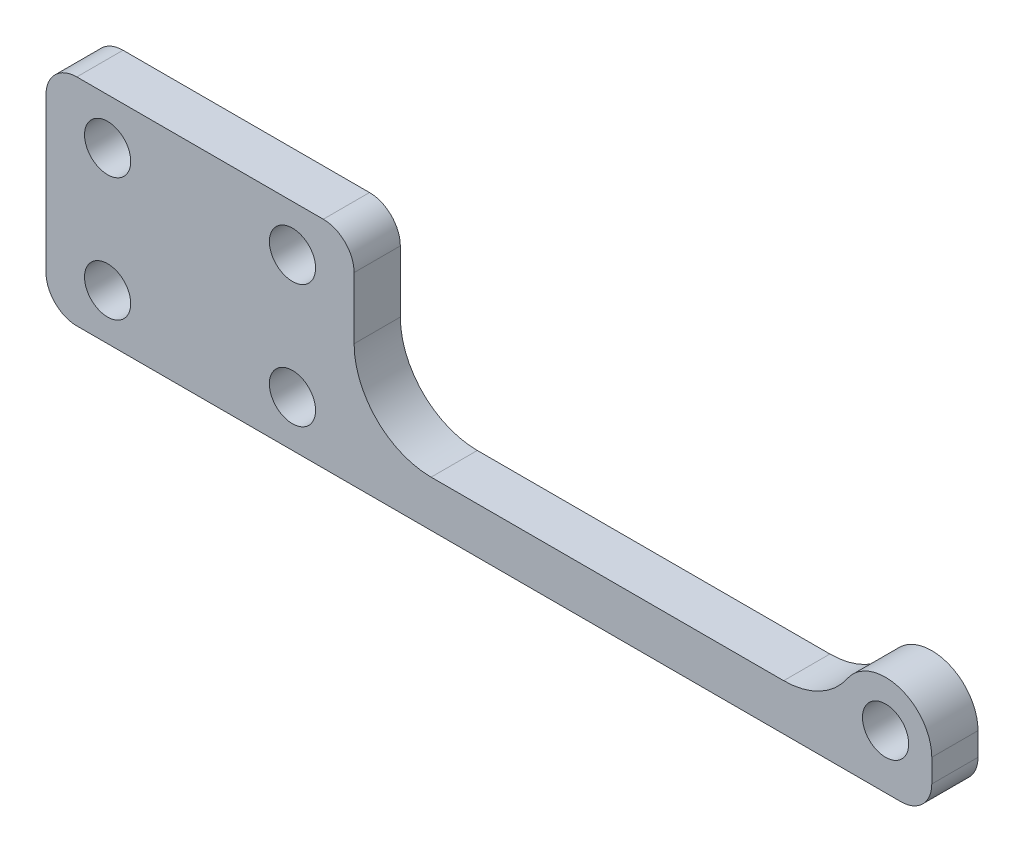
ISO-10303-21;
HEADER;
FILE_DESCRIPTION(('STEP AP214'),'2;1');
FILE_NAME('part.step','',(''),(''),'','','');
FILE_SCHEMA(('AUTOMOTIVE_DESIGN { 1 0 10303 214 1 1 1 1 }'));
ENDSEC;
DATA;
#1=APPLICATION_CONTEXT('core data for automotive mechanical design processes');
#2=APPLICATION_PROTOCOL_DEFINITION('international standard','automotive_design',2000,#1);
#3=PRODUCT_CONTEXT('',#1,'mechanical');
#4=PRODUCT('Part','Part','',(#3));
#5=PRODUCT_RELATED_PRODUCT_CATEGORY('part','',(#4));
#6=PRODUCT_DEFINITION_FORMATION('','',#4);
#7=PRODUCT_DEFINITION_CONTEXT('part definition',#1,'design');
#8=PRODUCT_DEFINITION('design','',#6,#7);
#9=PRODUCT_DEFINITION_SHAPE('','',#8);
#10=(LENGTH_UNIT() NAMED_UNIT(*) SI_UNIT(.MILLI.,.METRE.));
#11=(NAMED_UNIT(*) PLANE_ANGLE_UNIT() SI_UNIT($,.RADIAN.));
#12=(NAMED_UNIT(*) SI_UNIT($,.STERADIAN.) SOLID_ANGLE_UNIT());
#13=UNCERTAINTY_MEASURE_WITH_UNIT(LENGTH_MEASURE(1.E-05),#10,'distance_accuracy_value','');
#14=(GEOMETRIC_REPRESENTATION_CONTEXT(3) GLOBAL_UNCERTAINTY_ASSIGNED_CONTEXT((#13)) GLOBAL_UNIT_ASSIGNED_CONTEXT((#10,
#11,#12)) REPRESENTATION_CONTEXT('',''));
#15=CARTESIAN_POINT('',(0.,0.,0.));
#16=DIRECTION('',(0.,0.,1.));
#17=DIRECTION('',(1.,0.,0.));
#18=AXIS2_PLACEMENT_3D('',#15,#16,#17);
#19=CARTESIAN_POINT('',(-10.,0.,3.));
#20=DIRECTION('',(-1.,0.,0.));
#21=DIRECTION('',(0.,-1.,0.));
#22=AXIS2_PLACEMENT_3D('',#19,#20,#21);
#23=PLANE('',#22);
#24=DIRECTION('',(0.,1.,0.));
#25=VECTOR('',#24,1.);
#26=CARTESIAN_POINT('',(-10.,0.,0.));
#27=LINE('',#26,#25);
#28=CARTESIAN_POINT('',(-10.,-5.,0.));
#29=VERTEX_POINT('',#28);
#30=CARTESIAN_POINT('',(-10.,5.,0.));
#31=VERTEX_POINT('',#30);
#32=EDGE_CURVE('E258',#29,#31,#27,.T.);
#33=ORIENTED_EDGE('',*,*,#32,.F.);
#34=DIRECTION('',(0.,0.,-1.));
#35=VECTOR('',#34,1.);
#36=CARTESIAN_POINT('',(-10.,-5.,3.));
#37=LINE('',#36,#35);
#38=CARTESIAN_POINT('',(-10.,-5.,3.));
#39=VERTEX_POINT('',#38);
#40=EDGE_CURVE('E191',#29,#39,#37,.F.);
#41=ORIENTED_EDGE('',*,*,#40,.T.);
#42=DIRECTION('',(0.,1.,0.));
#43=VECTOR('',#42,1.);
#44=CARTESIAN_POINT('',(-10.,0.,3.));
#45=LINE('',#44,#43);
#46=CARTESIAN_POINT('',(-10.,5.,3.));
#47=VERTEX_POINT('',#46);
#48=EDGE_CURVE('E287',#39,#47,#45,.T.);
#49=ORIENTED_EDGE('',*,*,#48,.T.);
#50=DIRECTION('',(0.,0.,-1.));
#51=VECTOR('',#50,1.);
#52=CARTESIAN_POINT('',(-10.,5.,0.));
#53=LINE('',#52,#51);
#54=EDGE_CURVE('E188',#47,#31,#53,.T.);
#55=ORIENTED_EDGE('',*,*,#54,.T.);
#56=EDGE_LOOP('',(#33,#41,#49,#55));
#57=FACE_BOUND('',#56,.T.);
#58=ADVANCED_FACE('F43',(#57),#23,.T.);
#59=CARTESIAN_POINT('',(0.,-7.,3.));
#60=DIRECTION('',(0.,-1.,0.));
#61=DIRECTION('',(1.,0.,0.));
#62=AXIS2_PLACEMENT_3D('',#59,#60,#61);
#63=PLANE('',#62);
#64=DIRECTION('',(-1.,0.,0.));
#65=VECTOR('',#64,1.);
#66=CARTESIAN_POINT('',(0.,-7.,3.));
#67=LINE('',#66,#65);
#68=CARTESIAN_POINT('',(45.5,-6.99999999999999,3.));
#69=VERTEX_POINT('',#68);
#70=CARTESIAN_POINT('',(-8.,-7.,3.));
#71=VERTEX_POINT('',#70);
#72=EDGE_CURVE('E150',#69,#71,#67,.T.);
#73=ORIENTED_EDGE('',*,*,#72,.T.);
#74=DIRECTION('',(0.,0.,-1.));
#75=VECTOR('',#74,1.);
#76=CARTESIAN_POINT('',(-8.,-7.,3.));
#77=LINE('',#76,#75);
#78=CARTESIAN_POINT('',(-8.,-7.,0.));
#79=VERTEX_POINT('',#78);
#80=EDGE_CURVE('E168',#71,#79,#77,.T.);
#81=ORIENTED_EDGE('',*,*,#80,.T.);
#82=DIRECTION('',(-1.,0.,0.));
#83=VECTOR('',#82,1.);
#84=CARTESIAN_POINT('',(0.,-7.,0.));
#85=LINE('',#84,#83);
#86=CARTESIAN_POINT('',(45.5,-6.99999999999999,0.));
#87=VERTEX_POINT('',#86);
#88=EDGE_CURVE('E261',#87,#79,#85,.T.);
#89=ORIENTED_EDGE('',*,*,#88,.F.);
#90=DIRECTION('',(0.,0.,-1.));
#91=VECTOR('',#90,1.);
#92=CARTESIAN_POINT('',(45.5,-6.99999999999999,3.));
#93=LINE('',#92,#91);
#94=EDGE_CURVE('E165',#87,#69,#93,.F.);
#95=ORIENTED_EDGE('',*,*,#94,.T.);
#96=EDGE_LOOP('',(#73,#81,#89,#95));
#97=FACE_BOUND('',#96,.T.);
#98=ADVANCED_FACE('F293',(#97),#63,.T.);
#99=CARTESIAN_POINT('',(47.5,0.,3.));
#100=DIRECTION('',(-1.,0.,0.));
#101=DIRECTION('',(0.,0.,1.));
#102=AXIS2_PLACEMENT_3D('',#99,#100,#101);
#103=PLANE('',#102);
#104=DIRECTION('',(0.,1.,0.));
#105=VECTOR('',#104,1.);
#106=CARTESIAN_POINT('',(47.5,0.,3.));
#107=LINE('',#106,#105);
#108=CARTESIAN_POINT('',(47.5,-4.99999999999999,3.));
#109=VERTEX_POINT('',#108);
#110=CARTESIAN_POINT('',(47.5,-3.5,3.));
#111=VERTEX_POINT('',#110);
#112=EDGE_CURVE('E136',#109,#111,#107,.T.);
#113=ORIENTED_EDGE('',*,*,#112,.F.);
#114=DIRECTION('',(0.,0.,-1.));
#115=VECTOR('',#114,1.);
#116=CARTESIAN_POINT('',(47.5,-4.99999999999999,0.));
#117=LINE('',#116,#115);
#118=CARTESIAN_POINT('',(47.5,-4.99999999999999,0.));
#119=VERTEX_POINT('',#118);
#120=EDGE_CURVE('E208',#109,#119,#117,.T.);
#121=ORIENTED_EDGE('',*,*,#120,.T.);
#122=DIRECTION('',(0.,1.,0.));
#123=VECTOR('',#122,1.);
#124=CARTESIAN_POINT('',(47.5,0.,0.));
#125=LINE('',#124,#123);
#126=CARTESIAN_POINT('',(47.5,-3.5,0.));
#127=VERTEX_POINT('',#126);
#128=EDGE_CURVE('E163',#119,#127,#125,.T.);
#129=ORIENTED_EDGE('',*,*,#128,.T.);
#130=DIRECTION('',(0.,0.,-1.));
#131=VECTOR('',#130,1.);
#132=CARTESIAN_POINT('',(47.5,-3.5,3.));
#133=LINE('',#132,#131);
#134=EDGE_CURVE('E156',#111,#127,#133,.T.);
#135=ORIENTED_EDGE('',*,*,#134,.F.);
#136=EDGE_LOOP('',(#113,#121,#129,#135));
#137=FACE_BOUND('',#136,.T.);
#138=ADVANCED_FACE('F161',(#137),#103,.F.);
#139=CARTESIAN_POINT('',(44.5,-3.5,3.));
#140=DIRECTION('',(0.,0.,-1.));
#141=DIRECTION('',(-1.,0.,0.));
#142=AXIS2_PLACEMENT_3D('',#139,#140,#141);
#143=CYLINDRICAL_SURFACE('',#142,3.);
#144=CARTESIAN_POINT('',(44.5,-3.5,0.));
#145=DIRECTION('',(0.,0.,1.));
#146=DIRECTION('',(1.,0.,0.));
#147=AXIS2_PLACEMENT_3D('',#144,#145,#146);
#148=CIRCLE('',#147,3.);
#149=CARTESIAN_POINT('',(42.0196081458769,-1.8125,0.));
#150=VERTEX_POINT('',#149);
#151=EDGE_CURVE('E234',#127,#150,#148,.T.);
#152=ORIENTED_EDGE('',*,*,#151,.T.);
#153=DIRECTION('',(0.,0.,-1.));
#154=VECTOR('',#153,1.);
#155=CARTESIAN_POINT('',(42.0196081458769,-1.8125,3.));
#156=LINE('',#155,#154);
#157=CARTESIAN_POINT('',(42.0196081458769,-1.8125,3.));
#158=VERTEX_POINT('',#157);
#159=EDGE_CURVE('E158',#150,#158,#156,.F.);
#160=ORIENTED_EDGE('',*,*,#159,.T.);
#161=CARTESIAN_POINT('',(44.5,-3.5,3.));
#162=DIRECTION('',(0.,0.,1.));
#163=DIRECTION('',(1.,0.,0.));
#164=AXIS2_PLACEMENT_3D('',#161,#162,#163);
#165=CIRCLE('',#164,3.);
#166=EDGE_CURVE('E141',#111,#158,#165,.T.);
#167=ORIENTED_EDGE('',*,*,#166,.F.);
#168=ORIENTED_EDGE('',*,*,#134,.T.);
#169=EDGE_LOOP('',(#152,#160,#167,#168));
#170=FACE_BOUND('',#169,.T.);
#171=ADVANCED_FACE('F155',(#170),#143,.T.);
#172=CARTESIAN_POINT('',(0.,-4.,3.));
#173=DIRECTION('',(0.,1.,0.));
#174=DIRECTION('',(0.,0.,1.));
#175=AXIS2_PLACEMENT_3D('',#172,#173,#174);
#176=PLANE('',#175);
#177=DIRECTION('',(1.,0.,0.));
#178=VECTOR('',#177,1.);
#179=CARTESIAN_POINT('',(0.,-4.,3.));
#180=LINE('',#179,#178);
#181=CARTESIAN_POINT('',(15.,-4.,3.));
#182=VERTEX_POINT('',#181);
#183=CARTESIAN_POINT('',(37.8856217223385,-4.,3.));
#184=VERTEX_POINT('',#183);
#185=EDGE_CURVE('E159',#182,#184,#180,.T.);
#186=ORIENTED_EDGE('',*,*,#185,.T.);
#187=DIRECTION('',(0.,0.,-1.));
#188=VECTOR('',#187,1.);
#189=CARTESIAN_POINT('',(37.8856217223385,-4.,3.));
#190=LINE('',#189,#188);
#191=CARTESIAN_POINT('',(37.8856217223385,-4.,0.));
#192=VERTEX_POINT('',#191);
#193=EDGE_CURVE('E212',#184,#192,#190,.T.);
#194=ORIENTED_EDGE('',*,*,#193,.T.);
#195=DIRECTION('',(1.,0.,0.));
#196=VECTOR('',#195,1.);
#197=CARTESIAN_POINT('',(0.,-4.,0.));
#198=LINE('',#197,#196);
#199=CARTESIAN_POINT('',(15.,-4.,0.));
#200=VERTEX_POINT('',#199);
#201=EDGE_CURVE('E228',#200,#192,#198,.T.);
#202=ORIENTED_EDGE('',*,*,#201,.F.);
#203=DIRECTION('',(0.,0.,-1.));
#204=VECTOR('',#203,1.);
#205=CARTESIAN_POINT('',(15.,-4.,3.));
#206=LINE('',#205,#204);
#207=EDGE_CURVE('E210',#200,#182,#206,.F.);
#208=ORIENTED_EDGE('',*,*,#207,.T.);
#209=EDGE_LOOP('',(#186,#194,#202,#208));
#210=FACE_BOUND('',#209,.T.);
#211=ADVANCED_FACE('F232',(#210),#176,.T.);
#212=CARTESIAN_POINT('',(10.,0.,3.));
#213=DIRECTION('',(-1.,0.,0.));
#214=DIRECTION('',(0.,0.,1.));
#215=AXIS2_PLACEMENT_3D('',#212,#213,#214);
#216=PLANE('',#215);
#217=DIRECTION('',(0.,1.,0.));
#218=VECTOR('',#217,1.);
#219=CARTESIAN_POINT('',(10.,0.,3.));
#220=LINE('',#219,#218);
#221=CARTESIAN_POINT('',(10.,1.,3.));
#222=VERTEX_POINT('',#221);
#223=CARTESIAN_POINT('',(10.,5.,3.));
#224=VERTEX_POINT('',#223);
#225=EDGE_CURVE('E238',#222,#224,#220,.T.);
#226=ORIENTED_EDGE('',*,*,#225,.F.);
#227=DIRECTION('',(0.,0.,-1.));
#228=VECTOR('',#227,1.);
#229=CARTESIAN_POINT('',(10.,1.,3.));
#230=LINE('',#229,#228);
#231=CARTESIAN_POINT('',(10.,1.,0.));
#232=VERTEX_POINT('',#231);
#233=EDGE_CURVE('E216',#222,#232,#230,.T.);
#234=ORIENTED_EDGE('',*,*,#233,.T.);
#235=DIRECTION('',(0.,1.,0.));
#236=VECTOR('',#235,1.);
#237=CARTESIAN_POINT('',(10.,0.,0.));
#238=LINE('',#237,#236);
#239=CARTESIAN_POINT('',(10.,5.,0.));
#240=VERTEX_POINT('',#239);
#241=EDGE_CURVE('E229',#232,#240,#238,.T.);
#242=ORIENTED_EDGE('',*,*,#241,.T.);
#243=DIRECTION('',(0.,0.,-1.));
#244=VECTOR('',#243,1.);
#245=CARTESIAN_POINT('',(10.,5.,3.));
#246=LINE('',#245,#244);
#247=EDGE_CURVE('E205',#240,#224,#246,.F.);
#248=ORIENTED_EDGE('',*,*,#247,.T.);
#249=EDGE_LOOP('',(#226,#234,#242,#248));
#250=FACE_BOUND('',#249,.T.);
#251=ADVANCED_FACE('F237',(#250),#216,.F.);
#252=CARTESIAN_POINT('',(0.,7.,3.));
#253=DIRECTION('',(0.,-1.,0.));
#254=DIRECTION('',(1.,0.,0.));
#255=AXIS2_PLACEMENT_3D('',#252,#253,#254);
#256=PLANE('',#255);
#257=DIRECTION('',(-1.,0.,0.));
#258=VECTOR('',#257,1.);
#259=CARTESIAN_POINT('',(0.,7.,0.));
#260=LINE('',#259,#258);
#261=CARTESIAN_POINT('',(8.,7.,0.));
#262=VERTEX_POINT('',#261);
#263=CARTESIAN_POINT('',(-8.00000000000001,7.,0.));
#264=VERTEX_POINT('',#263);
#265=EDGE_CURVE('E265',#262,#264,#260,.T.);
#266=ORIENTED_EDGE('',*,*,#265,.T.);
#267=DIRECTION('',(0.,0.,-1.));
#268=VECTOR('',#267,1.);
#269=CARTESIAN_POINT('',(-8.00000000000001,7.,3.));
#270=LINE('',#269,#268);
#271=CARTESIAN_POINT('',(-8.00000000000001,7.,3.));
#272=VERTEX_POINT('',#271);
#273=EDGE_CURVE('E203',#264,#272,#270,.F.);
#274=ORIENTED_EDGE('',*,*,#273,.T.);
#275=DIRECTION('',(-1.,0.,0.));
#276=VECTOR('',#275,1.);
#277=CARTESIAN_POINT('',(0.,7.,3.));
#278=LINE('',#277,#276);
#279=CARTESIAN_POINT('',(8.,7.,3.));
#280=VERTEX_POINT('',#279);
#281=EDGE_CURVE('E171',#280,#272,#278,.T.);
#282=ORIENTED_EDGE('',*,*,#281,.F.);
#283=DIRECTION('',(0.,0.,-1.));
#284=VECTOR('',#283,1.);
#285=CARTESIAN_POINT('',(8.,7.,3.));
#286=LINE('',#285,#284);
#287=EDGE_CURVE('E200',#280,#262,#286,.T.);
#288=ORIENTED_EDGE('',*,*,#287,.T.);
#289=EDGE_LOOP('',(#266,#274,#282,#288));
#290=FACE_BOUND('',#289,.T.);
#291=ADVANCED_FACE('F310',(#290),#256,.F.);
#292=CARTESIAN_POINT('',(-6.,4.,3.));
#293=DIRECTION('',(0.,0.,-1.));
#294=DIRECTION('',(-1.,0.,0.));
#295=AXIS2_PLACEMENT_3D('',#292,#293,#294);
#296=CYLINDRICAL_SURFACE('',#295,1.5);
#297=CARTESIAN_POINT('',(-6.,4.,3.));
#298=DIRECTION('',(0.,0.,1.));
#299=DIRECTION('',(1.,0.,0.));
#300=AXIS2_PLACEMENT_3D('',#297,#298,#299);
#301=CIRCLE('',#300,1.5);
#302=CARTESIAN_POINT('',(-4.5,4.,3.));
#303=VERTEX_POINT('',#302);
#304=EDGE_CURVE('E284',#303,#303,#301,.T.);
#305=ORIENTED_EDGE('',*,*,#304,.T.);
#306=EDGE_LOOP('',(#305));
#307=FACE_BOUND('',#306,.T.);
#308=CARTESIAN_POINT('',(-6.,4.,0.));
#309=DIRECTION('',(0.,0.,1.));
#310=DIRECTION('',(1.,0.,0.));
#311=AXIS2_PLACEMENT_3D('',#308,#309,#310);
#312=CIRCLE('',#311,1.5);
#313=CARTESIAN_POINT('',(-4.5,4.,0.));
#314=VERTEX_POINT('',#313);
#315=EDGE_CURVE('E255',#314,#314,#312,.T.);
#316=ORIENTED_EDGE('',*,*,#315,.F.);
#317=EDGE_LOOP('',(#316));
#318=FACE_BOUND('',#317,.T.);
#319=ADVANCED_FACE('F312',(#307,#318),#296,.F.);
#320=CARTESIAN_POINT('',(6.,4.,3.));
#321=DIRECTION('',(0.,0.,-1.));
#322=DIRECTION('',(-1.,0.,0.));
#323=AXIS2_PLACEMENT_3D('',#320,#321,#322);
#324=CYLINDRICAL_SURFACE('',#323,1.5);
#325=CARTESIAN_POINT('',(6.,4.,3.));
#326=DIRECTION('',(0.,0.,1.));
#327=DIRECTION('',(1.,0.,0.));
#328=AXIS2_PLACEMENT_3D('',#325,#326,#327);
#329=CIRCLE('',#328,1.5);
#330=CARTESIAN_POINT('',(7.5,4.,3.));
#331=VERTEX_POINT('',#330);
#332=EDGE_CURVE('E279',#331,#331,#329,.T.);
#333=ORIENTED_EDGE('',*,*,#332,.T.);
#334=EDGE_LOOP('',(#333));
#335=FACE_BOUND('',#334,.T.);
#336=CARTESIAN_POINT('',(6.,4.,0.));
#337=DIRECTION('',(0.,0.,1.));
#338=DIRECTION('',(1.,0.,0.));
#339=AXIS2_PLACEMENT_3D('',#336,#337,#338);
#340=CIRCLE('',#339,1.5);
#341=CARTESIAN_POINT('',(7.5,4.,0.));
#342=VERTEX_POINT('',#341);
#343=EDGE_CURVE('E252',#342,#342,#340,.T.);
#344=ORIENTED_EDGE('',*,*,#343,.F.);
#345=EDGE_LOOP('',(#344));
#346=FACE_BOUND('',#345,.T.);
#347=ADVANCED_FACE('F319',(#335,#346),#324,.F.);
#348=CARTESIAN_POINT('',(6.,-4.,3.));
#349=DIRECTION('',(0.,0.,-1.));
#350=DIRECTION('',(-1.,0.,0.));
#351=AXIS2_PLACEMENT_3D('',#348,#349,#350);
#352=CYLINDRICAL_SURFACE('',#351,1.5);
#353=CARTESIAN_POINT('',(6.,-4.,3.));
#354=DIRECTION('',(0.,0.,1.));
#355=DIRECTION('',(1.,0.,0.));
#356=AXIS2_PLACEMENT_3D('',#353,#354,#355);
#357=CIRCLE('',#356,1.5);
#358=CARTESIAN_POINT('',(7.5,-4.,3.));
#359=VERTEX_POINT('',#358);
#360=EDGE_CURVE('E274',#359,#359,#357,.T.);
#361=ORIENTED_EDGE('',*,*,#360,.T.);
#362=EDGE_LOOP('',(#361));
#363=FACE_BOUND('',#362,.T.);
#364=CARTESIAN_POINT('',(6.,-4.,0.));
#365=DIRECTION('',(0.,0.,1.));
#366=DIRECTION('',(1.,0.,0.));
#367=AXIS2_PLACEMENT_3D('',#364,#365,#366);
#368=CIRCLE('',#367,1.5);
#369=CARTESIAN_POINT('',(7.5,-4.,0.));
#370=VERTEX_POINT('',#369);
#371=EDGE_CURVE('E249',#370,#370,#368,.T.);
#372=ORIENTED_EDGE('',*,*,#371,.F.);
#373=EDGE_LOOP('',(#372));
#374=FACE_BOUND('',#373,.T.);
#375=ADVANCED_FACE('F336',(#363,#374),#352,.F.);
#376=CARTESIAN_POINT('',(-6.,-4.,3.));
#377=DIRECTION('',(0.,0.,-1.));
#378=DIRECTION('',(-1.,0.,0.));
#379=AXIS2_PLACEMENT_3D('',#376,#377,#378);
#380=CYLINDRICAL_SURFACE('',#379,1.5);
#381=CARTESIAN_POINT('',(-6.,-4.,3.));
#382=DIRECTION('',(0.,0.,1.));
#383=DIRECTION('',(1.,0.,0.));
#384=AXIS2_PLACEMENT_3D('',#381,#382,#383);
#385=CIRCLE('',#384,1.5);
#386=CARTESIAN_POINT('',(-4.5,-4.,3.));
#387=VERTEX_POINT('',#386);
#388=EDGE_CURVE('E271',#387,#387,#385,.T.);
#389=ORIENTED_EDGE('',*,*,#388,.T.);
#390=EDGE_LOOP('',(#389));
#391=FACE_BOUND('',#390,.T.);
#392=CARTESIAN_POINT('',(-6.,-4.,0.));
#393=DIRECTION('',(0.,0.,1.));
#394=DIRECTION('',(1.,0.,0.));
#395=AXIS2_PLACEMENT_3D('',#392,#393,#394);
#396=CIRCLE('',#395,1.5);
#397=CARTESIAN_POINT('',(-4.5,-4.,0.));
#398=VERTEX_POINT('',#397);
#399=EDGE_CURVE('E246',#398,#398,#396,.T.);
#400=ORIENTED_EDGE('',*,*,#399,.F.);
#401=EDGE_LOOP('',(#400));
#402=FACE_BOUND('',#401,.T.);
#403=ADVANCED_FACE('F340',(#391,#402),#380,.F.);
#404=CARTESIAN_POINT('',(44.5,-3.5,3.));
#405=DIRECTION('',(0.,0.,-1.));
#406=DIRECTION('',(-1.,0.,0.));
#407=AXIS2_PLACEMENT_3D('',#404,#405,#406);
#408=CYLINDRICAL_SURFACE('',#407,1.5);
#409=CARTESIAN_POINT('',(44.5,-3.5,3.));
#410=DIRECTION('',(0.,0.,1.));
#411=DIRECTION('',(1.,0.,0.));
#412=AXIS2_PLACEMENT_3D('',#409,#410,#411);
#413=CIRCLE('',#412,1.5);
#414=CARTESIAN_POINT('',(46.,-3.5,3.));
#415=VERTEX_POINT('',#414);
#416=EDGE_CURVE('E166',#415,#415,#413,.T.);
#417=ORIENTED_EDGE('',*,*,#416,.T.);
#418=EDGE_LOOP('',(#417));
#419=FACE_BOUND('',#418,.T.);
#420=CARTESIAN_POINT('',(44.5,-3.5,0.));
#421=DIRECTION('',(0.,0.,1.));
#422=DIRECTION('',(1.,0.,0.));
#423=AXIS2_PLACEMENT_3D('',#420,#421,#422);
#424=CIRCLE('',#423,1.5);
#425=CARTESIAN_POINT('',(46.,-3.5,0.));
#426=VERTEX_POINT('',#425);
#427=EDGE_CURVE('E174',#426,#426,#424,.T.);
#428=ORIENTED_EDGE('',*,*,#427,.F.);
#429=EDGE_LOOP('',(#428));
#430=FACE_BOUND('',#429,.T.);
#431=ADVANCED_FACE('F344',(#419,#430),#408,.F.);
#432=CARTESIAN_POINT('',(0.,0.,3.));
#433=DIRECTION('',(0.,0.,1.));
#434=DIRECTION('',(1.,0.,0.));
#435=AXIS2_PLACEMENT_3D('',#432,#433,#434);
#436=PLANE('',#435);
#437=ORIENTED_EDGE('',*,*,#388,.F.);
#438=EDGE_LOOP('',(#437));
#439=FACE_BOUND('',#438,.T.);
#440=ORIENTED_EDGE('',*,*,#360,.F.);
#441=EDGE_LOOP('',(#440));
#442=FACE_BOUND('',#441,.T.);
#443=ORIENTED_EDGE('',*,*,#332,.F.);
#444=EDGE_LOOP('',(#443));
#445=FACE_BOUND('',#444,.T.);
#446=ORIENTED_EDGE('',*,*,#304,.F.);
#447=EDGE_LOOP('',(#446));
#448=FACE_BOUND('',#447,.T.);
#449=ORIENTED_EDGE('',*,*,#48,.F.);
#450=CARTESIAN_POINT('',(-8.,-5.,3.));
#451=DIRECTION('',(0.,0.,1.));
#452=DIRECTION('',(1.,0.,0.));
#453=AXIS2_PLACEMENT_3D('',#450,#451,#452);
#454=CIRCLE('',#453,2.);
#455=EDGE_CURVE('E198',#39,#71,#454,.T.);
#456=ORIENTED_EDGE('',*,*,#455,.T.);
#457=ORIENTED_EDGE('',*,*,#72,.F.);
#458=CARTESIAN_POINT('',(45.5,-4.99999999999999,3.));
#459=DIRECTION('',(0.,0.,1.));
#460=DIRECTION('',(1.,0.,0.));
#461=AXIS2_PLACEMENT_3D('',#458,#459,#460);
#462=CIRCLE('',#461,2.);
#463=EDGE_CURVE('E145',#69,#109,#462,.T.);
#464=ORIENTED_EDGE('',*,*,#463,.T.);
#465=ORIENTED_EDGE('',*,*,#112,.T.);
#466=ORIENTED_EDGE('',*,*,#166,.T.);
#467=CARTESIAN_POINT('',(37.8856217223385,1.,3.));
#468=DIRECTION('',(0.,0.,1.));
#469=DIRECTION('',(1.,0.,0.));
#470=AXIS2_PLACEMENT_3D('',#467,#468,#469);
#471=CIRCLE('',#470,5.);
#472=EDGE_CURVE('E220',#158,#184,#471,.F.);
#473=ORIENTED_EDGE('',*,*,#472,.T.);
#474=ORIENTED_EDGE('',*,*,#185,.F.);
#475=CARTESIAN_POINT('',(15.,1.,3.));
#476=DIRECTION('',(0.,0.,1.));
#477=DIRECTION('',(1.,0.,0.));
#478=AXIS2_PLACEMENT_3D('',#475,#476,#477);
#479=CIRCLE('',#478,5.);
#480=EDGE_CURVE('E11',#182,#222,#479,.F.);
#481=ORIENTED_EDGE('',*,*,#480,.T.);
#482=ORIENTED_EDGE('',*,*,#225,.T.);
#483=CARTESIAN_POINT('',(8.,5.,3.));
#484=DIRECTION('',(0.,0.,1.));
#485=DIRECTION('',(1.,0.,0.));
#486=AXIS2_PLACEMENT_3D('',#483,#484,#485);
#487=CIRCLE('',#486,2.);
#488=EDGE_CURVE('E194',#224,#280,#487,.T.);
#489=ORIENTED_EDGE('',*,*,#488,.T.);
#490=ORIENTED_EDGE('',*,*,#281,.T.);
#491=CARTESIAN_POINT('',(-8.00000000000001,5.,3.));
#492=DIRECTION('',(0.,0.,1.));
#493=DIRECTION('',(1.,0.,0.));
#494=AXIS2_PLACEMENT_3D('',#491,#492,#493);
#495=CIRCLE('',#494,2.);
#496=EDGE_CURVE('E196',#272,#47,#495,.T.);
#497=ORIENTED_EDGE('',*,*,#496,.T.);
#498=EDGE_LOOP('',(#449,#456,#457,#464,#465,#466,#473,#474,#481,#482,#489,#490,#497));
#499=FACE_BOUND('',#498,.T.);
#500=ORIENTED_EDGE('',*,*,#416,.F.);
#501=EDGE_LOOP('',(#500));
#502=FACE_BOUND('',#501,.T.);
#503=ADVANCED_FACE('F139',(#439,#442,#445,#448,#499,#502),#436,.T.);
#504=CARTESIAN_POINT('',(0.,0.,0.));
#505=DIRECTION('',(0.,0.,1.));
#506=DIRECTION('',(1.,0.,0.));
#507=AXIS2_PLACEMENT_3D('',#504,#505,#506);
#508=PLANE('',#507);
#509=ORIENTED_EDGE('',*,*,#399,.T.);
#510=EDGE_LOOP('',(#509));
#511=FACE_BOUND('',#510,.T.);
#512=ORIENTED_EDGE('',*,*,#371,.T.);
#513=EDGE_LOOP('',(#512));
#514=FACE_BOUND('',#513,.T.);
#515=ORIENTED_EDGE('',*,*,#343,.T.);
#516=EDGE_LOOP('',(#515));
#517=FACE_BOUND('',#516,.T.);
#518=ORIENTED_EDGE('',*,*,#315,.T.);
#519=EDGE_LOOP('',(#518));
#520=FACE_BOUND('',#519,.T.);
#521=ORIENTED_EDGE('',*,*,#88,.T.);
#522=CARTESIAN_POINT('',(-8.,-5.,0.));
#523=DIRECTION('',(0.,0.,1.));
#524=DIRECTION('',(1.,0.,0.));
#525=AXIS2_PLACEMENT_3D('',#522,#523,#524);
#526=CIRCLE('',#525,2.);
#527=EDGE_CURVE('E186',#79,#29,#526,.F.);
#528=ORIENTED_EDGE('',*,*,#527,.T.);
#529=ORIENTED_EDGE('',*,*,#32,.T.);
#530=CARTESIAN_POINT('',(-8.00000000000001,5.,0.));
#531=DIRECTION('',(0.,0.,1.));
#532=DIRECTION('',(1.,0.,0.));
#533=AXIS2_PLACEMENT_3D('',#530,#531,#532);
#534=CIRCLE('',#533,2.);
#535=EDGE_CURVE('E184',#31,#264,#534,.F.);
#536=ORIENTED_EDGE('',*,*,#535,.T.);
#537=ORIENTED_EDGE('',*,*,#265,.F.);
#538=CARTESIAN_POINT('',(8.,5.,0.));
#539=DIRECTION('',(0.,0.,1.));
#540=DIRECTION('',(1.,0.,0.));
#541=AXIS2_PLACEMENT_3D('',#538,#539,#540);
#542=CIRCLE('',#541,2.);
#543=EDGE_CURVE('E181',#262,#240,#542,.F.);
#544=ORIENTED_EDGE('',*,*,#543,.T.);
#545=ORIENTED_EDGE('',*,*,#241,.F.);
#546=CARTESIAN_POINT('',(15.,1.,0.));
#547=DIRECTION('',(0.,0.,1.));
#548=DIRECTION('',(1.,0.,0.));
#549=AXIS2_PLACEMENT_3D('',#546,#547,#548);
#550=CIRCLE('',#549,5.);
#551=EDGE_CURVE('E51',#232,#200,#550,.T.);
#552=ORIENTED_EDGE('',*,*,#551,.T.);
#553=ORIENTED_EDGE('',*,*,#201,.T.);
#554=CARTESIAN_POINT('',(37.8856217223385,1.,0.));
#555=DIRECTION('',(0.,0.,1.));
#556=DIRECTION('',(1.,0.,0.));
#557=AXIS2_PLACEMENT_3D('',#554,#555,#556);
#558=CIRCLE('',#557,5.);
#559=EDGE_CURVE('E218',#192,#150,#558,.T.);
#560=ORIENTED_EDGE('',*,*,#559,.T.);
#561=ORIENTED_EDGE('',*,*,#151,.F.);
#562=ORIENTED_EDGE('',*,*,#128,.F.);
#563=CARTESIAN_POINT('',(45.5,-4.99999999999999,0.));
#564=DIRECTION('',(0.,0.,1.));
#565=DIRECTION('',(1.,0.,0.));
#566=AXIS2_PLACEMENT_3D('',#563,#564,#565);
#567=CIRCLE('',#566,2.);
#568=EDGE_CURVE('E179',#119,#87,#567,.F.);
#569=ORIENTED_EDGE('',*,*,#568,.T.);
#570=EDGE_LOOP('',(#521,#528,#529,#536,#537,#544,#545,#552,#553,#560,#561,#562,#569));
#571=FACE_BOUND('',#570,.T.);
#572=ORIENTED_EDGE('',*,*,#427,.T.);
#573=EDGE_LOOP('',(#572));
#574=FACE_BOUND('',#573,.T.);
#575=ADVANCED_FACE('F226',(#511,#514,#517,#520,#571,#574),#508,.F.);
#576=CARTESIAN_POINT('',(-8.,-5.,3.));
#577=DIRECTION('',(0.,0.,-1.));
#578=DIRECTION('',(-1.,0.,0.));
#579=AXIS2_PLACEMENT_3D('',#576,#577,#578);
#580=CYLINDRICAL_SURFACE('',#579,2.);
#581=ORIENTED_EDGE('',*,*,#455,.F.);
#582=ORIENTED_EDGE('',*,*,#40,.F.);
#583=ORIENTED_EDGE('',*,*,#527,.F.);
#584=ORIENTED_EDGE('',*,*,#80,.F.);
#585=EDGE_LOOP('',(#581,#582,#583,#584));
#586=FACE_BOUND('',#585,.T.);
#587=ADVANCED_FACE('F298',(#586),#580,.T.);
#588=CARTESIAN_POINT('',(-8.00000000000001,5.,3.));
#589=DIRECTION('',(0.,0.,1.));
#590=DIRECTION('',(1.,0.,0.));
#591=AXIS2_PLACEMENT_3D('',#588,#589,#590);
#592=CYLINDRICAL_SURFACE('',#591,2.);
#593=ORIENTED_EDGE('',*,*,#496,.F.);
#594=ORIENTED_EDGE('',*,*,#273,.F.);
#595=ORIENTED_EDGE('',*,*,#535,.F.);
#596=ORIENTED_EDGE('',*,*,#54,.F.);
#597=EDGE_LOOP('',(#593,#594,#595,#596));
#598=FACE_BOUND('',#597,.T.);
#599=ADVANCED_FACE('F305',(#598),#592,.T.);
#600=CARTESIAN_POINT('',(8.,5.,3.));
#601=DIRECTION('',(0.,0.,-1.));
#602=DIRECTION('',(-1.,0.,0.));
#603=AXIS2_PLACEMENT_3D('',#600,#601,#602);
#604=CYLINDRICAL_SURFACE('',#603,2.);
#605=ORIENTED_EDGE('',*,*,#488,.F.);
#606=ORIENTED_EDGE('',*,*,#247,.F.);
#607=ORIENTED_EDGE('',*,*,#543,.F.);
#608=ORIENTED_EDGE('',*,*,#287,.F.);
#609=EDGE_LOOP('',(#605,#606,#607,#608));
#610=FACE_BOUND('',#609,.T.);
#611=ADVANCED_FACE('F308',(#610),#604,.T.);
#612=CARTESIAN_POINT('',(45.5,-4.99999999999999,3.));
#613=DIRECTION('',(0.,0.,1.));
#614=DIRECTION('',(1.,0.,0.));
#615=AXIS2_PLACEMENT_3D('',#612,#613,#614);
#616=CYLINDRICAL_SURFACE('',#615,2.);
#617=ORIENTED_EDGE('',*,*,#463,.F.);
#618=ORIENTED_EDGE('',*,*,#94,.F.);
#619=ORIENTED_EDGE('',*,*,#568,.F.);
#620=ORIENTED_EDGE('',*,*,#120,.F.);
#621=EDGE_LOOP('',(#617,#618,#619,#620));
#622=FACE_BOUND('',#621,.T.);
#623=ADVANCED_FACE('F350',(#622),#616,.T.);
#624=CARTESIAN_POINT('',(37.8856217223385,1.,3.));
#625=DIRECTION('',(0.,0.,-1.));
#626=DIRECTION('',(-1.,0.,0.));
#627=AXIS2_PLACEMENT_3D('',#624,#625,#626);
#628=CYLINDRICAL_SURFACE('',#627,5.);
#629=ORIENTED_EDGE('',*,*,#472,.F.);
#630=ORIENTED_EDGE('',*,*,#159,.F.);
#631=ORIENTED_EDGE('',*,*,#559,.F.);
#632=ORIENTED_EDGE('',*,*,#193,.F.);
#633=EDGE_LOOP('',(#629,#630,#631,#632));
#634=FACE_BOUND('',#633,.T.);
#635=ADVANCED_FACE('F352',(#634),#628,.F.);
#636=CARTESIAN_POINT('',(15.,1.,3.));
#637=DIRECTION('',(0.,0.,-1.));
#638=DIRECTION('',(-1.,0.,0.));
#639=AXIS2_PLACEMENT_3D('',#636,#637,#638);
#640=CYLINDRICAL_SURFACE('',#639,5.);
#641=ORIENTED_EDGE('',*,*,#480,.F.);
#642=ORIENTED_EDGE('',*,*,#207,.F.);
#643=ORIENTED_EDGE('',*,*,#551,.F.);
#644=ORIENTED_EDGE('',*,*,#233,.F.);
#645=EDGE_LOOP('',(#641,#642,#643,#644));
#646=FACE_BOUND('',#645,.T.);
#647=ADVANCED_FACE('F45',(#646),#640,.F.);
#648=CLOSED_SHELL('',(#58,#98,#138,#171,#211,#251,#291,#319,#347,#375,#403,#431,#503,#575,#587,
#599,#611,#623,#635,#647));
#649=MANIFOLD_SOLID_BREP('B2',#648);
#650=ADVANCED_BREP_SHAPE_REPRESENTATION('',(#18,#649),#14);
#651=SHAPE_DEFINITION_REPRESENTATION(#9,#650);
ENDSEC;
END-ISO-10303-21;
